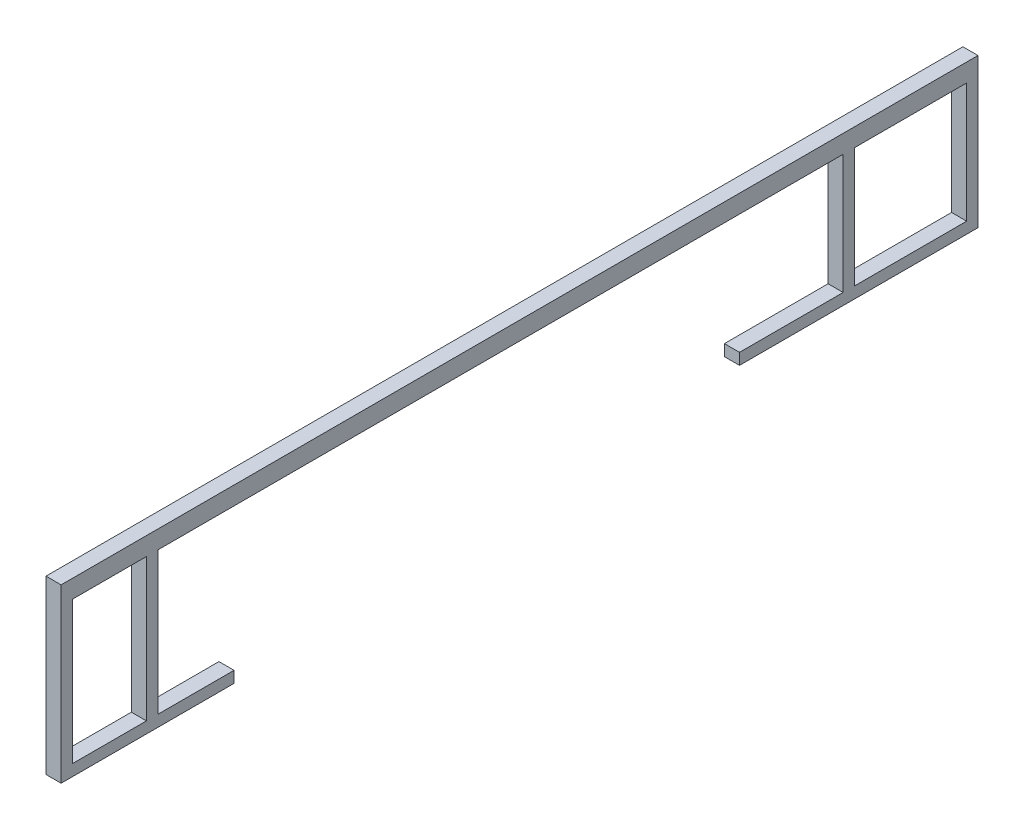
ISO-10303-21;
HEADER;
FILE_DESCRIPTION(('STEP AP214'),'2;1');
FILE_NAME('part.step','',(''),(''),'','','');
FILE_SCHEMA(('AUTOMOTIVE_DESIGN { 1 0 10303 214 1 1 1 1 }'));
ENDSEC;
DATA;
#1=APPLICATION_CONTEXT('core data for automotive mechanical design processes');
#2=APPLICATION_PROTOCOL_DEFINITION('international standard','automotive_design',2000,#1);
#3=PRODUCT_CONTEXT('',#1,'mechanical');
#4=PRODUCT('Part','Part','',(#3));
#5=PRODUCT_RELATED_PRODUCT_CATEGORY('part','',(#4));
#6=PRODUCT_DEFINITION_FORMATION('','',#4);
#7=PRODUCT_DEFINITION_CONTEXT('part definition',#1,'design');
#8=PRODUCT_DEFINITION('design','',#6,#7);
#9=PRODUCT_DEFINITION_SHAPE('','',#8);
#10=(LENGTH_UNIT() NAMED_UNIT(*) SI_UNIT(.MILLI.,.METRE.));
#11=(NAMED_UNIT(*) PLANE_ANGLE_UNIT() SI_UNIT($,.RADIAN.));
#12=(NAMED_UNIT(*) SI_UNIT($,.STERADIAN.) SOLID_ANGLE_UNIT());
#13=UNCERTAINTY_MEASURE_WITH_UNIT(LENGTH_MEASURE(1.E-05),#10,'distance_accuracy_value','');
#14=(GEOMETRIC_REPRESENTATION_CONTEXT(3) GLOBAL_UNCERTAINTY_ASSIGNED_CONTEXT((#13)) GLOBAL_UNIT_ASSIGNED_CONTEXT((#10,
#11,#12)) REPRESENTATION_CONTEXT('',''));
#15=CARTESIAN_POINT('',(0.,0.,0.));
#16=DIRECTION('',(0.,0.,1.));
#17=DIRECTION('',(1.,0.,0.));
#18=AXIS2_PLACEMENT_3D('',#15,#16,#17);
#19=CARTESIAN_POINT('',(1100.,-1000.,-1020.));
#20=CARTESIAN_POINT('',(1100.,-366.,-1020.));
#21=CARTESIAN_POINT('',(1180.,-1000.,-1020.));
#22=CARTESIAN_POINT('',(1180.,-366.,-1020.));
#23=B_SPLINE_SURFACE_WITH_KNOTS('',1,1,((#19,#20),(#21,#22)),.UNSPECIFIED.,.F.,.F.,.F.,(2,2),(2,
2),(0.,80.),(0.,634.),.UNSPECIFIED.);
#24=CARTESIAN_POINT('',(1180.,-270.,-1020.));
#25=CARTESIAN_POINT('',(1180.,-1180.,-1020.));
#26=B_SPLINE_CURVE_WITH_KNOTS('',1,(#24,#25),.UNSPECIFIED.,.F.,.F.,(2,2),(0.,910.),.UNSPECIFIED.);
#27=CARTESIAN_POINT('',(1180.,-366.,-1020.));
#28=VERTEX_POINT('',#27);
#29=CARTESIAN_POINT('',(1180.,-1000.,-1020.));
#30=VERTEX_POINT('',#29);
#31=EDGE_CURVE('E1258',#28,#30,#26,.T.);
#32=CARTESIAN_POINT('',(1100.,-366.,-1020.));
#33=CARTESIAN_POINT('',(1180.,-366.,-1020.));
#34=B_SPLINE_CURVE_WITH_KNOTS('',1,(#32,#33),.UNSPECIFIED.,.F.,.F.,(2,2),(0.,80.),.UNSPECIFIED.);
#35=CARTESIAN_POINT('',(1100.,-366.,-1020.));
#36=VERTEX_POINT('',#35);
#37=EDGE_CURVE('E221',#36,#28,#34,.T.);
#38=CARTESIAN_POINT('',(1100.,-1180.,-1020.));
#39=CARTESIAN_POINT('',(1100.,-270.,-1020.));
#40=B_SPLINE_CURVE_WITH_KNOTS('',1,(#38,#39),.UNSPECIFIED.,.F.,.F.,(2,2),(-814.,96.),.UNSPECIFIED.);
#41=CARTESIAN_POINT('',(1100.,-1000.,-1020.));
#42=VERTEX_POINT('',#41);
#43=EDGE_CURVE('E218',#42,#36,#40,.T.);
#44=CARTESIAN_POINT('',(1180.,-1000.,-1020.));
#45=CARTESIAN_POINT('',(1100.,-1000.,-1020.));
#46=B_SPLINE_CURVE_WITH_KNOTS('',1,(#44,#45),.UNSPECIFIED.,.F.,.F.,(2,2),(0.,80.),.UNSPECIFIED.);
#47=EDGE_CURVE('E200',#30,#42,#46,.T.);
#48=ORIENTED_EDGE('',*,*,#31,.F.);
#49=ORIENTED_EDGE('',*,*,#37,.F.);
#50=ORIENTED_EDGE('',*,*,#43,.F.);
#51=ORIENTED_EDGE('',*,*,#47,.F.);
#52=EDGE_LOOP('',(#48,#49,#50,#51));
#53=FACE_BOUND('',#52,.T.);
#54=ADVANCED_FACE('F18',(#53),#23,.T.);
#55=CARTESIAN_POINT('',(1180.,-1000.,-1674.));
#56=CARTESIAN_POINT('',(1180.,-1000.,-471.));
#57=CARTESIAN_POINT('',(1100.,-1000.,-1674.));
#58=CARTESIAN_POINT('',(1100.,-1000.,-471.));
#59=B_SPLINE_SURFACE_WITH_KNOTS('',1,1,((#55,#56),(#57,#58)),.UNSPECIFIED.,.F.,.F.,.F.,(2,2),(2,
2),(0.,80.),(0.,1203.),.UNSPECIFIED.);
#60=CARTESIAN_POINT('',(1180.,-1000.,-1734.));
#61=CARTESIAN_POINT('',(1180.,-1000.,3122.));
#62=B_SPLINE_CURVE_WITH_KNOTS('',1,(#60,#61),.UNSPECIFIED.,.F.,.F.,(2,2),(0.,4856.),.UNSPECIFIED.);
#63=CARTESIAN_POINT('',(1180.,-1000.,-471.));
#64=VERTEX_POINT('',#63);
#65=EDGE_CURVE('E209',#30,#64,#62,.T.);
#66=CARTESIAN_POINT('',(1100.,-1000.,3122.));
#67=CARTESIAN_POINT('',(1100.,-1000.,-1734.));
#68=B_SPLINE_CURVE_WITH_KNOTS('',1,(#66,#67),.UNSPECIFIED.,.F.,.F.,(2,2),(0.,4856.),.UNSPECIFIED.);
#69=CARTESIAN_POINT('',(1100.,-1000.,-471.));
#70=VERTEX_POINT('',#69);
#71=EDGE_CURVE('E205',#70,#42,#68,.T.);
#72=CARTESIAN_POINT('',(1180.,-1000.,-471.));
#73=CARTESIAN_POINT('',(1100.,-1000.,-471.));
#74=B_SPLINE_CURVE_WITH_KNOTS('',1,(#72,#73),.UNSPECIFIED.,.F.,.F.,(2,2),(1100.,1180.),.UNSPECIFIED.);
#75=EDGE_CURVE('E214',#64,#70,#74,.T.);
#76=ORIENTED_EDGE('',*,*,#65,.F.);
#77=ORIENTED_EDGE('',*,*,#47,.T.);
#78=ORIENTED_EDGE('',*,*,#71,.F.);
#79=ORIENTED_EDGE('',*,*,#75,.F.);
#80=EDGE_LOOP('',(#76,#77,#78,#79));
#81=FACE_BOUND('',#80,.T.);
#82=ADVANCED_FACE('F203',(#81),#59,.T.);
#83=CARTESIAN_POINT('',(1100.,-1000.,-471.));
#84=CARTESIAN_POINT('',(1180.,-1000.,-471.));
#85=CARTESIAN_POINT('',(1100.,-1060.,-471.));
#86=CARTESIAN_POINT('',(1180.,-1060.,-471.));
#87=B_SPLINE_SURFACE_WITH_KNOTS('',1,1,((#83,#84),(#85,#86)),.UNSPECIFIED.,.F.,.F.,.F.,(2,2),(2,
2),(-60.,0.),(1100.,1180.),.UNSPECIFIED.);
#88=CARTESIAN_POINT('',(1100.,-1180.,-471.));
#89=CARTESIAN_POINT('',(1100.,-270.,-471.));
#90=B_SPLINE_CURVE_WITH_KNOTS('',1,(#88,#89),.UNSPECIFIED.,.F.,.F.,(2,2),(-814.,96.),.UNSPECIFIED.);
#91=CARTESIAN_POINT('',(1100.,-1060.,-471.));
#92=VERTEX_POINT('',#91);
#93=EDGE_CURVE('E234',#92,#70,#90,.T.);
#94=CARTESIAN_POINT('',(1180.,-1060.,-471.));
#95=CARTESIAN_POINT('',(1100.,-1060.,-471.));
#96=B_SPLINE_CURVE_WITH_KNOTS('',1,(#94,#95),.UNSPECIFIED.,.F.,.F.,(2,2),(1100.,1180.),.UNSPECIFIED.);
#97=CARTESIAN_POINT('',(1180.,-1060.,-471.));
#98=VERTEX_POINT('',#97);
#99=EDGE_CURVE('E1078',#98,#92,#96,.T.);
#100=CARTESIAN_POINT('',(1180.,-270.,-471.));
#101=CARTESIAN_POINT('',(1180.,-1180.,-471.));
#102=B_SPLINE_CURVE_WITH_KNOTS('',1,(#100,#101),.UNSPECIFIED.,.F.,.F.,(2,2),(0.,910.),.UNSPECIFIED.);
#103=EDGE_CURVE('E1089',#64,#98,#102,.T.);
#104=ORIENTED_EDGE('',*,*,#75,.T.);
#105=ORIENTED_EDGE('',*,*,#93,.F.);
#106=ORIENTED_EDGE('',*,*,#99,.F.);
#107=ORIENTED_EDGE('',*,*,#103,.F.);
#108=EDGE_LOOP('',(#104,#105,#106,#107));
#109=FACE_BOUND('',#108,.T.);
#110=ADVANCED_FACE('F1041',(#109),#87,.T.);
#111=CARTESIAN_POINT('',(1100.,-1060.,-471.));
#112=CARTESIAN_POINT('',(1180.,-1060.,-471.));
#113=CARTESIAN_POINT('',(1100.,-1060.,-1734.));
#114=CARTESIAN_POINT('',(1180.,-1060.,-1734.));
#115=B_SPLINE_SURFACE_WITH_KNOTS('',1,1,((#111,#112),(#113,#114)),.UNSPECIFIED.,.F.,.F.,.F.,(2,
2),(2,2),(3593.,4856.),(1100.,1180.),.UNSPECIFIED.);
#116=CARTESIAN_POINT('',(1100.,-1060.,-1734.));
#117=CARTESIAN_POINT('',(1100.,-1060.,3122.));
#118=B_SPLINE_CURVE_WITH_KNOTS('',1,(#116,#117),.UNSPECIFIED.,.F.,.F.,(2,2),(0.,4856.),.UNSPECIFIED.);
#119=CARTESIAN_POINT('',(1100.,-1060.,-1734.));
#120=VERTEX_POINT('',#119);
#121=EDGE_CURVE('E1066',#120,#92,#118,.T.);
#122=CARTESIAN_POINT('',(1100.,-1060.,-1734.));
#123=CARTESIAN_POINT('',(1180.,-1060.,-1734.));
#124=B_SPLINE_CURVE_WITH_KNOTS('',1,(#122,#123),.UNSPECIFIED.,.F.,.F.,(2,2),(1100.,1180.),.UNSPECIFIED.);
#125=CARTESIAN_POINT('',(1180.,-1060.,-1734.));
#126=VERTEX_POINT('',#125);
#127=EDGE_CURVE('E992',#120,#126,#124,.T.);
#128=CARTESIAN_POINT('',(1180.,-1060.,3122.));
#129=CARTESIAN_POINT('',(1180.,-1060.,-1734.));
#130=B_SPLINE_CURVE_WITH_KNOTS('',1,(#128,#129),.UNSPECIFIED.,.F.,.F.,(2,2),(0.,4856.),.UNSPECIFIED.);
#131=EDGE_CURVE('E1461',#98,#126,#130,.T.);
#132=ORIENTED_EDGE('',*,*,#99,.T.);
#133=ORIENTED_EDGE('',*,*,#121,.F.);
#134=ORIENTED_EDGE('',*,*,#127,.T.);
#135=ORIENTED_EDGE('',*,*,#131,.F.);
#136=EDGE_LOOP('',(#132,#133,#134,#135));
#137=FACE_BOUND('',#136,.T.);
#138=ADVANCED_FACE('F1030',(#137),#115,.T.);
#139=CARTESIAN_POINT('',(1180.,-1060.,-1734.));
#140=CARTESIAN_POINT('',(1100.,-1060.,-1734.));
#141=CARTESIAN_POINT('',(1180.,-270.,-1734.));
#142=CARTESIAN_POINT('',(1100.,-270.,-1734.));
#143=B_SPLINE_SURFACE_WITH_KNOTS('',1,1,((#139,#140),(#141,#142)),.UNSPECIFIED.,.F.,.F.,.F.,(2,
2),(2,2),(-1060.,-270.),(-1180.,-1100.),.UNSPECIFIED.);
#144=CARTESIAN_POINT('',(1180.,-1180.,-1734.));
#145=CARTESIAN_POINT('',(1180.,-270.,-1734.));
#146=B_SPLINE_CURVE_WITH_KNOTS('',1,(#144,#145),.UNSPECIFIED.,.F.,.F.,(2,2),(0.,910.),.UNSPECIFIED.);
#147=CARTESIAN_POINT('',(1180.,-270.,-1734.));
#148=VERTEX_POINT('',#147);
#149=EDGE_CURVE('E1003',#126,#148,#146,.T.);
#150=CARTESIAN_POINT('',(1100.,-270.,-1734.));
#151=CARTESIAN_POINT('',(1100.,-1180.,-1734.));
#152=B_SPLINE_CURVE_WITH_KNOTS('',1,(#150,#151),.UNSPECIFIED.,.F.,.F.,(2,2),(-814.,96.),.UNSPECIFIED.);
#153=CARTESIAN_POINT('',(1100.,-270.,-1734.));
#154=VERTEX_POINT('',#153);
#155=EDGE_CURVE('E980',#154,#120,#152,.T.);
#156=CARTESIAN_POINT('',(1180.,-270.,-1734.));
#157=CARTESIAN_POINT('',(1100.,-270.,-1734.));
#158=B_SPLINE_CURVE_WITH_KNOTS('',1,(#156,#157),.UNSPECIFIED.,.F.,.F.,(2,2),(0.,80.),.UNSPECIFIED.);
#159=EDGE_CURVE('E1014',#148,#154,#158,.T.);
#160=ORIENTED_EDGE('',*,*,#149,.F.);
#161=ORIENTED_EDGE('',*,*,#127,.F.);
#162=ORIENTED_EDGE('',*,*,#155,.F.);
#163=ORIENTED_EDGE('',*,*,#159,.F.);
#164=EDGE_LOOP('',(#160,#161,#162,#163));
#165=FACE_BOUND('',#164,.T.);
#166=ADVANCED_FACE('F942',(#165),#143,.F.);
#167=CARTESIAN_POINT('',(1100.,-270.,3122.));
#168=CARTESIAN_POINT('',(1100.,-270.,-1734.));
#169=CARTESIAN_POINT('',(1180.,-270.,3122.));
#170=CARTESIAN_POINT('',(1180.,-270.,-1734.));
#171=B_SPLINE_SURFACE_WITH_KNOTS('',1,1,((#167,#168),(#169,#170)),.UNSPECIFIED.,.F.,.F.,.F.,(2,
2),(2,2),(0.,80.),(0.,4856.),.UNSPECIFIED.);
#172=CARTESIAN_POINT('',(1100.,-270.,3122.));
#173=CARTESIAN_POINT('',(1100.,-270.,-1734.));
#174=B_SPLINE_CURVE_WITH_KNOTS('',1,(#172,#173),.UNSPECIFIED.,.F.,.F.,(2,2),(0.,4856.),.UNSPECIFIED.);
#175=CARTESIAN_POINT('',(1100.,-270.,3122.));
#176=VERTEX_POINT('',#175);
#177=EDGE_CURVE('E1500',#176,#154,#174,.T.);
#178=CARTESIAN_POINT('',(1100.,-270.,3122.));
#179=CARTESIAN_POINT('',(1180.,-270.,3122.));
#180=B_SPLINE_CURVE_WITH_KNOTS('',1,(#178,#179),.UNSPECIFIED.,.F.,.F.,(2,2),(0.,80.),.UNSPECIFIED.);
#181=CARTESIAN_POINT('',(1180.,-270.,3122.));
#182=VERTEX_POINT('',#181);
#183=EDGE_CURVE('E912',#176,#182,#180,.T.);
#184=CARTESIAN_POINT('',(1180.,-270.,-1734.));
#185=CARTESIAN_POINT('',(1180.,-270.,3122.));
#186=B_SPLINE_CURVE_WITH_KNOTS('',1,(#184,#185),.UNSPECIFIED.,.F.,.F.,(2,2),(0.,4856.),.UNSPECIFIED.);
#187=EDGE_CURVE('E925',#148,#182,#186,.T.);
#188=ORIENTED_EDGE('',*,*,#177,.F.);
#189=ORIENTED_EDGE('',*,*,#183,.T.);
#190=ORIENTED_EDGE('',*,*,#187,.F.);
#191=ORIENTED_EDGE('',*,*,#159,.T.);
#192=EDGE_LOOP('',(#188,#189,#190,#191));
#193=FACE_BOUND('',#192,.T.);
#194=ADVANCED_FACE('F931',(#193),#171,.T.);
#195=CARTESIAN_POINT('',(1100.,-1180.,3122.));
#196=CARTESIAN_POINT('',(1180.,-1180.,3122.));
#197=CARTESIAN_POINT('',(1100.,-270.,3122.));
#198=CARTESIAN_POINT('',(1180.,-270.,3122.));
#199=B_SPLINE_SURFACE_WITH_KNOTS('',1,1,((#195,#196),(#197,#198)),.UNSPECIFIED.,.F.,.F.,.F.,(2,
2),(2,2),(-1180.,-270.),(1100.,1180.),.UNSPECIFIED.);
#200=CARTESIAN_POINT('',(1100.,-1180.,3122.));
#201=CARTESIAN_POINT('',(1100.,-270.,3122.));
#202=B_SPLINE_CURVE_WITH_KNOTS('',1,(#200,#201),.UNSPECIFIED.,.F.,.F.,(2,2),(-814.,96.),.UNSPECIFIED.);
#203=CARTESIAN_POINT('',(1100.,-1180.,3122.));
#204=VERTEX_POINT('',#203);
#205=EDGE_CURVE('E901',#204,#176,#202,.T.);
#206=CARTESIAN_POINT('',(1180.,-1180.,3122.));
#207=CARTESIAN_POINT('',(1100.,-1180.,3122.));
#208=B_SPLINE_CURVE_WITH_KNOTS('',1,(#206,#207),.UNSPECIFIED.,.F.,.F.,(2,2),(1100.,1180.),.UNSPECIFIED.);
#209=CARTESIAN_POINT('',(1180.,-1180.,3122.));
#210=VERTEX_POINT('',#209);
#211=EDGE_CURVE('E824',#210,#204,#208,.T.);
#212=CARTESIAN_POINT('',(1180.,-270.,3122.));
#213=CARTESIAN_POINT('',(1180.,-1180.,3122.));
#214=B_SPLINE_CURVE_WITH_KNOTS('',1,(#212,#213),.UNSPECIFIED.,.F.,.F.,(2,2),(0.,910.),.UNSPECIFIED.);
#215=EDGE_CURVE('E880',#182,#210,#214,.T.);
#216=ORIENTED_EDGE('',*,*,#205,.F.);
#217=ORIENTED_EDGE('',*,*,#211,.F.);
#218=ORIENTED_EDGE('',*,*,#215,.F.);
#219=ORIENTED_EDGE('',*,*,#183,.F.);
#220=EDGE_LOOP('',(#216,#217,#218,#219));
#221=FACE_BOUND('',#220,.T.);
#222=ADVANCED_FACE('F841',(#221),#199,.F.);
#223=CARTESIAN_POINT('',(1100.,-1180.,3122.));
#224=CARTESIAN_POINT('',(1180.,-1180.,3122.));
#225=CARTESIAN_POINT('',(1100.,-1180.,2206.));
#226=CARTESIAN_POINT('',(1180.,-1180.,2206.));
#227=B_SPLINE_SURFACE_WITH_KNOTS('',1,1,((#223,#224),(#225,#226)),.UNSPECIFIED.,.F.,.F.,.F.,(2,
2),(2,2),(0.,916.),(1100.,1180.),.UNSPECIFIED.);
#228=CARTESIAN_POINT('',(1180.,-1180.,2206.));
#229=CARTESIAN_POINT('',(1100.,-1180.,2206.));
#230=B_SPLINE_CURVE_WITH_KNOTS('',1,(#228,#229),.UNSPECIFIED.,.F.,.F.,(2,2),(1100.,1180.),.UNSPECIFIED.);
#231=CARTESIAN_POINT('',(1180.,-1180.,2206.));
#232=VERTEX_POINT('',#231);
#233=CARTESIAN_POINT('',(1100.,-1180.,2206.));
#234=VERTEX_POINT('',#233);
#235=EDGE_CURVE('E790',#232,#234,#230,.T.);
#236=CARTESIAN_POINT('',(1180.,-1180.,3122.));
#237=CARTESIAN_POINT('',(1180.,-1180.,-1734.));
#238=B_SPLINE_CURVE_WITH_KNOTS('',1,(#236,#237),.UNSPECIFIED.,.F.,.F.,(2,2),(0.,4856.),.UNSPECIFIED.);
#239=EDGE_CURVE('E867',#210,#232,#238,.T.);
#240=CARTESIAN_POINT('',(1100.,-1180.,-1734.));
#241=CARTESIAN_POINT('',(1100.,-1180.,3122.));
#242=B_SPLINE_CURVE_WITH_KNOTS('',1,(#240,#241),.UNSPECIFIED.,.F.,.F.,(2,2),(0.,4856.),.UNSPECIFIED.);
#243=EDGE_CURVE('E1422',#234,#204,#242,.T.);
#244=ORIENTED_EDGE('',*,*,#235,.F.);
#245=ORIENTED_EDGE('',*,*,#239,.F.);
#246=ORIENTED_EDGE('',*,*,#211,.T.);
#247=ORIENTED_EDGE('',*,*,#243,.F.);
#248=EDGE_LOOP('',(#244,#245,#246,#247));
#249=FACE_BOUND('',#248,.T.);
#250=ADVANCED_FACE('F830',(#249),#227,.T.);
#251=CARTESIAN_POINT('',(1100.,-1180.,2206.));
#252=CARTESIAN_POINT('',(1180.,-1180.,2206.));
#253=CARTESIAN_POINT('',(1100.,-1120.,2206.));
#254=CARTESIAN_POINT('',(1180.,-1120.,2206.));
#255=B_SPLINE_SURFACE_WITH_KNOTS('',1,1,((#251,#252),(#253,#254)),.UNSPECIFIED.,.F.,.F.,.F.,(2,
2),(2,2),(0.,60.),(1100.,1180.),.UNSPECIFIED.);
#256=CARTESIAN_POINT('',(1100.,-270.,2206.));
#257=CARTESIAN_POINT('',(1100.,-1180.,2206.));
#258=B_SPLINE_CURVE_WITH_KNOTS('',1,(#256,#257),.UNSPECIFIED.,.F.,.F.,(2,2),(-814.,96.),.UNSPECIFIED.);
#259=CARTESIAN_POINT('',(1100.,-1120.,2206.));
#260=VERTEX_POINT('',#259);
#261=EDGE_CURVE('E802',#260,#234,#258,.T.);
#262=CARTESIAN_POINT('',(1180.,-1120.,2206.));
#263=CARTESIAN_POINT('',(1100.,-1120.,2206.));
#264=B_SPLINE_CURVE_WITH_KNOTS('',1,(#262,#263),.UNSPECIFIED.,.F.,.F.,(2,2),(0.,80.),.UNSPECIFIED.);
#265=CARTESIAN_POINT('',(1180.,-1120.,2206.));
#266=VERTEX_POINT('',#265);
#267=EDGE_CURVE('E812',#266,#260,#264,.T.);
#268=CARTESIAN_POINT('',(1180.,-1180.,2206.));
#269=CARTESIAN_POINT('',(1180.,-270.,2206.));
#270=B_SPLINE_CURVE_WITH_KNOTS('',1,(#268,#269),.UNSPECIFIED.,.F.,.F.,(2,2),(0.,910.),.UNSPECIFIED.);
#271=EDGE_CURVE('E779',#232,#266,#270,.T.);
#272=ORIENTED_EDGE('',*,*,#261,.F.);
#273=ORIENTED_EDGE('',*,*,#267,.F.);
#274=ORIENTED_EDGE('',*,*,#271,.F.);
#275=ORIENTED_EDGE('',*,*,#235,.T.);
#276=EDGE_LOOP('',(#272,#273,#274,#275));
#277=FACE_BOUND('',#276,.T.);
#278=ADVANCED_FACE('F742',(#277),#255,.T.);
#279=CARTESIAN_POINT('',(1100.,-1120.,3062.));
#280=CARTESIAN_POINT('',(1100.,-1120.,2206.));
#281=CARTESIAN_POINT('',(1180.,-1120.,3062.));
#282=CARTESIAN_POINT('',(1180.,-1120.,2206.));
#283=B_SPLINE_SURFACE_WITH_KNOTS('',1,1,((#279,#280),(#281,#282)),.UNSPECIFIED.,.F.,.F.,.F.,(2,
2),(2,2),(0.,80.),(0.,856.),.UNSPECIFIED.);
#284=CARTESIAN_POINT('',(1100.,-1120.,3122.));
#285=CARTESIAN_POINT('',(1100.,-1120.,-1734.));
#286=B_SPLINE_CURVE_WITH_KNOTS('',1,(#284,#285),.UNSPECIFIED.,.F.,.F.,(2,2),(0.,4856.),.UNSPECIFIED.);
#287=CARTESIAN_POINT('',(1100.,-1120.,2610.));
#288=VERTEX_POINT('',#287);
#289=EDGE_CURVE('E1423',#288,#260,#286,.T.);
#290=CARTESIAN_POINT('',(1180.,-1120.,2610.));
#291=CARTESIAN_POINT('',(1100.,-1120.,2610.));
#292=B_SPLINE_CURVE_WITH_KNOTS('',1,(#290,#291),.UNSPECIFIED.,.F.,.F.,(2,2),(0.,80.),.UNSPECIFIED.);
#293=CARTESIAN_POINT('',(1180.,-1120.,2610.));
#294=VERTEX_POINT('',#293);
#295=EDGE_CURVE('E692',#294,#288,#292,.T.);
#296=CARTESIAN_POINT('',(1180.,-1120.,-1734.));
#297=CARTESIAN_POINT('',(1180.,-1120.,3122.));
#298=B_SPLINE_CURVE_WITH_KNOTS('',1,(#296,#297),.UNSPECIFIED.,.F.,.F.,(2,2),(0.,4856.),.UNSPECIFIED.);
#299=EDGE_CURVE('E725',#266,#294,#298,.T.);
#300=ORIENTED_EDGE('',*,*,#289,.F.);
#301=ORIENTED_EDGE('',*,*,#295,.F.);
#302=ORIENTED_EDGE('',*,*,#299,.F.);
#303=ORIENTED_EDGE('',*,*,#267,.T.);
#304=EDGE_LOOP('',(#300,#301,#302,#303));
#305=FACE_BOUND('',#304,.T.);
#306=ADVANCED_FACE('F731',(#305),#283,.T.);
#307=CARTESIAN_POINT('',(1100.,-366.,2610.));
#308=CARTESIAN_POINT('',(1100.,-1120.,2610.));
#309=CARTESIAN_POINT('',(1180.,-366.,2610.));
#310=CARTESIAN_POINT('',(1180.,-1120.,2610.));
#311=B_SPLINE_SURFACE_WITH_KNOTS('',1,1,((#307,#308),(#309,#310)),.UNSPECIFIED.,.F.,.F.,.F.,(2,
2),(2,2),(0.,80.),(0.,754.),.UNSPECIFIED.);
#312=CARTESIAN_POINT('',(1100.,-270.,2610.));
#313=CARTESIAN_POINT('',(1100.,-1180.,2610.));
#314=B_SPLINE_CURVE_WITH_KNOTS('',1,(#312,#313),.UNSPECIFIED.,.F.,.F.,(2,2),(-814.,96.),.UNSPECIFIED.);
#315=CARTESIAN_POINT('',(1100.,-366.,2610.));
#316=VERTEX_POINT('',#315);
#317=EDGE_CURVE('E703',#316,#288,#314,.T.);
#318=CARTESIAN_POINT('',(1180.,-366.,2610.));
#319=CARTESIAN_POINT('',(1100.,-366.,2610.));
#320=B_SPLINE_CURVE_WITH_KNOTS('',1,(#318,#319),.UNSPECIFIED.,.F.,.F.,(2,2),(0.,80.),.UNSPECIFIED.);
#321=CARTESIAN_POINT('',(1180.,-366.,2610.));
#322=VERTEX_POINT('',#321);
#323=EDGE_CURVE('E667',#322,#316,#320,.T.);
#324=CARTESIAN_POINT('',(1180.,-1180.,2610.));
#325=CARTESIAN_POINT('',(1180.,-270.,2610.));
#326=B_SPLINE_CURVE_WITH_KNOTS('',1,(#324,#325),.UNSPECIFIED.,.F.,.F.,(2,2),(0.,910.),.UNSPECIFIED.);
#327=EDGE_CURVE('E681',#294,#322,#326,.T.);
#328=ORIENTED_EDGE('',*,*,#317,.F.);
#329=ORIENTED_EDGE('',*,*,#323,.F.);
#330=ORIENTED_EDGE('',*,*,#327,.F.);
#331=ORIENTED_EDGE('',*,*,#295,.T.);
#332=EDGE_LOOP('',(#328,#329,#330,#331));
#333=FACE_BOUND('',#332,.T.);
#334=ADVANCED_FACE('F640',(#333),#311,.T.);
#335=CARTESIAN_POINT('',(1180.,-366.,3062.));
#336=CARTESIAN_POINT('',(1180.,-366.,-1674.));
#337=CARTESIAN_POINT('',(1100.,-366.,3062.));
#338=CARTESIAN_POINT('',(1100.,-366.,-1674.));
#339=B_SPLINE_SURFACE_WITH_KNOTS('',1,1,((#335,#336),(#337,#338)),.UNSPECIFIED.,.F.,.F.,.F.,(2,
2),(2,2),(0.,80.),(60.,4796.),.UNSPECIFIED.);
#340=CARTESIAN_POINT('',(1180.,-366.,3122.));
#341=CARTESIAN_POINT('',(1180.,-366.,-1734.));
#342=B_SPLINE_CURVE_WITH_KNOTS('',1,(#340,#341),.UNSPECIFIED.,.F.,.F.,(2,2),(0.,4856.),.UNSPECIFIED.);
#343=EDGE_CURVE('E1520',#322,#28,#342,.T.);
#344=CARTESIAN_POINT('',(1100.,-366.,-1734.));
#345=CARTESIAN_POINT('',(1100.,-366.,3122.));
#346=B_SPLINE_CURVE_WITH_KNOTS('',1,(#344,#345),.UNSPECIFIED.,.F.,.F.,(2,2),(0.,4856.),.UNSPECIFIED.);
#347=EDGE_CURVE('E227',#36,#316,#346,.T.);
#348=ORIENTED_EDGE('',*,*,#343,.F.);
#349=ORIENTED_EDGE('',*,*,#323,.T.);
#350=ORIENTED_EDGE('',*,*,#347,.F.);
#351=ORIENTED_EDGE('',*,*,#37,.T.);
#352=EDGE_LOOP('',(#348,#349,#350,#351));
#353=FACE_BOUND('',#352,.T.);
#354=ADVANCED_FACE('F629',(#353),#339,.T.);
#355=CARTESIAN_POINT('',(1180.,-366.,-1674.));
#356=CARTESIAN_POINT('',(1180.,-1000.,-1674.));
#357=CARTESIAN_POINT('',(1100.,-366.,-1674.));
#358=CARTESIAN_POINT('',(1100.,-1000.,-1674.));
#359=B_SPLINE_SURFACE_WITH_KNOTS('',1,1,((#355,#356),(#357,#358)),.UNSPECIFIED.,.F.,.F.,.F.,(2,
2),(2,2),(0.,80.),(92.,726.),.UNSPECIFIED.);
#360=CARTESIAN_POINT('',(1100.,-1180.,-1674.));
#361=CARTESIAN_POINT('',(1100.,-270.,-1674.));
#362=B_SPLINE_CURVE_WITH_KNOTS('',1,(#360,#361),.UNSPECIFIED.,.F.,.F.,(2,2),(-814.,96.),.UNSPECIFIED.);
#363=CARTESIAN_POINT('',(1100.,-1000.,-1674.));
#364=VERTEX_POINT('',#363);
#365=CARTESIAN_POINT('',(1100.,-366.,-1674.));
#366=VERTEX_POINT('',#365);
#367=EDGE_CURVE('E604',#364,#366,#362,.T.);
#368=CARTESIAN_POINT('',(1180.,-1000.,-1674.));
#369=CARTESIAN_POINT('',(1100.,-1000.,-1674.));
#370=B_SPLINE_CURVE_WITH_KNOTS('',1,(#368,#369),.UNSPECIFIED.,.F.,.F.,(2,2),(0.,80.),.UNSPECIFIED.);
#371=CARTESIAN_POINT('',(1180.,-1000.,-1674.));
#372=VERTEX_POINT('',#371);
#373=EDGE_CURVE('E614',#372,#364,#370,.T.);
#374=CARTESIAN_POINT('',(1180.,-270.,-1674.));
#375=CARTESIAN_POINT('',(1180.,-1180.,-1674.));
#376=B_SPLINE_CURVE_WITH_KNOTS('',1,(#374,#375),.UNSPECIFIED.,.F.,.F.,(2,2),(0.,910.),.UNSPECIFIED.);
#377=CARTESIAN_POINT('',(1180.,-366.,-1674.));
#378=VERTEX_POINT('',#377);
#379=EDGE_CURVE('E585',#378,#372,#376,.T.);
#380=CARTESIAN_POINT('',(1100.,-366.,-1674.));
#381=CARTESIAN_POINT('',(1180.,-366.,-1674.));
#382=B_SPLINE_CURVE_WITH_KNOTS('',1,(#380,#381),.UNSPECIFIED.,.F.,.F.,(2,2),(0.,80.),.UNSPECIFIED.);
#383=EDGE_CURVE('E427',#366,#378,#382,.T.);
#384=ORIENTED_EDGE('',*,*,#367,.F.);
#385=ORIENTED_EDGE('',*,*,#373,.F.);
#386=ORIENTED_EDGE('',*,*,#379,.F.);
#387=ORIENTED_EDGE('',*,*,#383,.F.);
#388=EDGE_LOOP('',(#384,#385,#386,#387));
#389=FACE_BOUND('',#388,.T.);
#390=ADVANCED_FACE('F549',(#389),#359,.T.);
#391=CARTESIAN_POINT('',(1180.,-1000.,-1674.));
#392=CARTESIAN_POINT('',(1180.,-1000.,-471.));
#393=CARTESIAN_POINT('',(1100.,-1000.,-1674.));
#394=CARTESIAN_POINT('',(1100.,-1000.,-471.));
#395=B_SPLINE_SURFACE_WITH_KNOTS('',1,1,((#391,#392),(#393,#394)),.UNSPECIFIED.,.F.,.F.,.F.,(2,
2),(2,2),(0.,80.),(0.,1203.),.UNSPECIFIED.);
#396=CARTESIAN_POINT('',(1100.,-1000.,3122.));
#397=CARTESIAN_POINT('',(1100.,-1000.,-1734.));
#398=B_SPLINE_CURVE_WITH_KNOTS('',1,(#396,#397),.UNSPECIFIED.,.F.,.F.,(2,2),(0.,4856.),.UNSPECIFIED.);
#399=CARTESIAN_POINT('',(1100.,-1000.,-1080.));
#400=VERTEX_POINT('',#399);
#401=EDGE_CURVE('E1474',#400,#364,#398,.T.);
#402=CARTESIAN_POINT('',(1180.,-1000.,-1080.));
#403=CARTESIAN_POINT('',(1100.,-1000.,-1080.));
#404=B_SPLINE_CURVE_WITH_KNOTS('',1,(#402,#403),.UNSPECIFIED.,.F.,.F.,(2,2),(0.,80.),.UNSPECIFIED.);
#405=CARTESIAN_POINT('',(1180.,-1000.,-1080.));
#406=VERTEX_POINT('',#405);
#407=EDGE_CURVE('E497',#406,#400,#404,.T.);
#408=CARTESIAN_POINT('',(1180.,-1000.,-1734.));
#409=CARTESIAN_POINT('',(1180.,-1000.,3122.));
#410=B_SPLINE_CURVE_WITH_KNOTS('',1,(#408,#409),.UNSPECIFIED.,.F.,.F.,(2,2),(0.,4856.),.UNSPECIFIED.);
#411=EDGE_CURVE('E532',#372,#406,#410,.T.);
#412=ORIENTED_EDGE('',*,*,#401,.F.);
#413=ORIENTED_EDGE('',*,*,#407,.F.);
#414=ORIENTED_EDGE('',*,*,#411,.F.);
#415=ORIENTED_EDGE('',*,*,#373,.T.);
#416=EDGE_LOOP('',(#412,#413,#414,#415));
#417=FACE_BOUND('',#416,.T.);
#418=ADVANCED_FACE('F538',(#417),#395,.T.);
#419=CARTESIAN_POINT('',(1180.,-1000.,-1080.));
#420=CARTESIAN_POINT('',(1180.,-366.,-1080.));
#421=CARTESIAN_POINT('',(1100.,-1000.,-1080.));
#422=CARTESIAN_POINT('',(1100.,-366.,-1080.));
#423=B_SPLINE_SURFACE_WITH_KNOTS('',1,1,((#419,#420),(#421,#422)),.UNSPECIFIED.,.F.,.F.,.F.,(2,
2),(2,2),(0.,80.),(0.,634.),.UNSPECIFIED.);
#424=CARTESIAN_POINT('',(1100.,-270.,-1080.));
#425=CARTESIAN_POINT('',(1100.,-1180.,-1080.));
#426=B_SPLINE_CURVE_WITH_KNOTS('',1,(#424,#425),.UNSPECIFIED.,.F.,.F.,(2,2),(-814.,96.),.UNSPECIFIED.);
#427=CARTESIAN_POINT('',(1100.,-366.,-1080.));
#428=VERTEX_POINT('',#427);
#429=EDGE_CURVE('E509',#428,#400,#426,.T.);
#430=CARTESIAN_POINT('',(1180.,-366.,-1080.));
#431=CARTESIAN_POINT('',(1100.,-366.,-1080.));
#432=B_SPLINE_CURVE_WITH_KNOTS('',1,(#430,#431),.UNSPECIFIED.,.F.,.F.,(2,2),(0.,80.),.UNSPECIFIED.);
#433=CARTESIAN_POINT('',(1180.,-366.,-1080.));
#434=VERTEX_POINT('',#433);
#435=EDGE_CURVE('E519',#434,#428,#432,.T.);
#436=CARTESIAN_POINT('',(1180.,-1180.,-1080.));
#437=CARTESIAN_POINT('',(1180.,-270.,-1080.));
#438=B_SPLINE_CURVE_WITH_KNOTS('',1,(#436,#437),.UNSPECIFIED.,.F.,.F.,(2,2),(0.,910.),.UNSPECIFIED.);
#439=EDGE_CURVE('E485',#406,#434,#438,.T.);
#440=ORIENTED_EDGE('',*,*,#429,.F.);
#441=ORIENTED_EDGE('',*,*,#435,.F.);
#442=ORIENTED_EDGE('',*,*,#439,.F.);
#443=ORIENTED_EDGE('',*,*,#407,.T.);
#444=EDGE_LOOP('',(#440,#441,#442,#443));
#445=FACE_BOUND('',#444,.T.);
#446=ADVANCED_FACE('F444',(#445),#423,.T.);
#447=CARTESIAN_POINT('',(1180.,-366.,3062.));
#448=CARTESIAN_POINT('',(1180.,-366.,-1674.));
#449=CARTESIAN_POINT('',(1100.,-366.,3062.));
#450=CARTESIAN_POINT('',(1100.,-366.,-1674.));
#451=B_SPLINE_SURFACE_WITH_KNOTS('',1,1,((#447,#448),(#449,#450)),.UNSPECIFIED.,.F.,.F.,.F.,(2,
2),(2,2),(0.,80.),(60.,4796.),.UNSPECIFIED.);
#452=CARTESIAN_POINT('',(1100.,-366.,-1734.));
#453=CARTESIAN_POINT('',(1100.,-366.,3122.));
#454=B_SPLINE_CURVE_WITH_KNOTS('',1,(#452,#453),.UNSPECIFIED.,.F.,.F.,(2,2),(0.,4856.),.UNSPECIFIED.);
#455=EDGE_CURVE('E471',#366,#428,#454,.T.);
#456=CARTESIAN_POINT('',(1180.,-366.,3122.));
#457=CARTESIAN_POINT('',(1180.,-366.,-1734.));
#458=B_SPLINE_CURVE_WITH_KNOTS('',1,(#456,#457),.UNSPECIFIED.,.F.,.F.,(2,2),(0.,4856.),.UNSPECIFIED.);
#459=EDGE_CURVE('E1373',#434,#378,#458,.T.);
#460=ORIENTED_EDGE('',*,*,#435,.T.);
#461=ORIENTED_EDGE('',*,*,#455,.F.);
#462=ORIENTED_EDGE('',*,*,#383,.T.);
#463=ORIENTED_EDGE('',*,*,#459,.F.);
#464=EDGE_LOOP('',(#460,#461,#462,#463));
#465=FACE_BOUND('',#464,.T.);
#466=ADVANCED_FACE('F433',(#465),#451,.T.);
#467=CARTESIAN_POINT('',(1180.,-366.,2670.));
#468=CARTESIAN_POINT('',(1180.,-1120.,2670.));
#469=CARTESIAN_POINT('',(1100.,-366.,2670.));
#470=CARTESIAN_POINT('',(1100.,-1120.,2670.));
#471=B_SPLINE_SURFACE_WITH_KNOTS('',1,1,((#467,#468),(#469,#470)),.UNSPECIFIED.,.F.,.F.,.F.,(2,
2),(2,2),(0.,80.),(0.,754.),.UNSPECIFIED.);
#472=CARTESIAN_POINT('',(1180.,-270.,2670.));
#473=CARTESIAN_POINT('',(1180.,-1180.,2670.));
#474=B_SPLINE_CURVE_WITH_KNOTS('',1,(#472,#473),.UNSPECIFIED.,.F.,.F.,(2,2),(0.,910.),.UNSPECIFIED.);
#475=CARTESIAN_POINT('',(1180.,-366.,2670.));
#476=VERTEX_POINT('',#475);
#477=CARTESIAN_POINT('',(1180.,-1120.,2670.));
#478=VERTEX_POINT('',#477);
#479=EDGE_CURVE('E402',#476,#478,#474,.T.);
#480=CARTESIAN_POINT('',(1100.,-366.,2670.));
#481=CARTESIAN_POINT('',(1180.,-366.,2670.));
#482=B_SPLINE_CURVE_WITH_KNOTS('',1,(#480,#481),.UNSPECIFIED.,.F.,.F.,(2,2),(0.,80.),.UNSPECIFIED.);
#483=CARTESIAN_POINT('',(1100.,-366.,2670.));
#484=VERTEX_POINT('',#483);
#485=EDGE_CURVE('E413',#484,#476,#482,.T.);
#486=CARTESIAN_POINT('',(1100.,-1180.,2670.));
#487=CARTESIAN_POINT('',(1100.,-270.,2670.));
#488=B_SPLINE_CURVE_WITH_KNOTS('',1,(#486,#487),.UNSPECIFIED.,.F.,.F.,(2,2),(-814.,96.),.UNSPECIFIED.);
#489=CARTESIAN_POINT('',(1100.,-1120.,2670.));
#490=VERTEX_POINT('',#489);
#491=EDGE_CURVE('E379',#490,#484,#488,.T.);
#492=CARTESIAN_POINT('',(1180.,-1120.,2670.));
#493=CARTESIAN_POINT('',(1100.,-1120.,2670.));
#494=B_SPLINE_CURVE_WITH_KNOTS('',1,(#492,#493),.UNSPECIFIED.,.F.,.F.,(2,2),(0.,80.),.UNSPECIFIED.);
#495=EDGE_CURVE('E392',#478,#490,#494,.T.);
#496=ORIENTED_EDGE('',*,*,#479,.F.);
#497=ORIENTED_EDGE('',*,*,#485,.F.);
#498=ORIENTED_EDGE('',*,*,#491,.F.);
#499=ORIENTED_EDGE('',*,*,#495,.F.);
#500=EDGE_LOOP('',(#496,#497,#498,#499));
#501=FACE_BOUND('',#500,.T.);
#502=ADVANCED_FACE('F257',(#501),#471,.T.);
#503=CARTESIAN_POINT('',(1100.,-1180.,3122.));
#504=CARTESIAN_POINT('',(1100.,-1180.,-1734.));
#505=CARTESIAN_POINT('',(1100.,-270.,3122.));
#506=CARTESIAN_POINT('',(1100.,-270.,-1734.));
#507=B_SPLINE_SURFACE_WITH_KNOTS('',1,1,((#503,#504),(#505,#506)),.UNSPECIFIED.,.F.,.F.,.F.,(2,
2),(2,2),(-814.,96.),(0.,4856.),.UNSPECIFIED.);
#508=CARTESIAN_POINT('',(1100.,-366.,3062.));
#509=CARTESIAN_POINT('',(1100.,-366.,-1674.));
#510=B_SPLINE_CURVE_WITH_KNOTS('',1,(#508,#509),.UNSPECIFIED.,.F.,.F.,(2,2),(60.,4796.),.UNSPECIFIED.);
#511=CARTESIAN_POINT('',(1100.,-366.,3062.));
#512=VERTEX_POINT('',#511);
#513=EDGE_CURVE('E365',#512,#484,#510,.T.);
#514=CARTESIAN_POINT('',(1100.,-1120.,3062.));
#515=CARTESIAN_POINT('',(1100.,-366.,3062.));
#516=B_SPLINE_CURVE_WITH_KNOTS('',1,(#514,#515),.UNSPECIFIED.,.F.,.F.,(2,2),(92.,846.),.UNSPECIFIED.);
#517=CARTESIAN_POINT('',(1100.,-1120.,3062.));
#518=VERTEX_POINT('',#517);
#519=EDGE_CURVE('E1505',#518,#512,#516,.T.);
#520=CARTESIAN_POINT('',(1100.,-1120.,2206.));
#521=CARTESIAN_POINT('',(1100.,-1120.,3062.));
#522=B_SPLINE_CURVE_WITH_KNOTS('',1,(#520,#521),.UNSPECIFIED.,.F.,.F.,(2,2),(0.,856.),.UNSPECIFIED.);
#523=EDGE_CURVE('E1219',#490,#518,#522,.T.);
#524=ORIENTED_EDGE('',*,*,#491,.T.);
#525=ORIENTED_EDGE('',*,*,#513,.F.);
#526=ORIENTED_EDGE('',*,*,#519,.F.);
#527=ORIENTED_EDGE('',*,*,#523,.F.);
#528=EDGE_LOOP('',(#524,#525,#526,#527));
#529=FACE_BOUND('',#528,.T.);
#530=ORIENTED_EDGE('',*,*,#429,.T.);
#531=ORIENTED_EDGE('',*,*,#401,.T.);
#532=ORIENTED_EDGE('',*,*,#367,.T.);
#533=ORIENTED_EDGE('',*,*,#455,.T.);
#534=EDGE_LOOP('',(#530,#531,#532,#533));
#535=FACE_BOUND('',#534,.T.);
#536=ORIENTED_EDGE('',*,*,#317,.T.);
#537=ORIENTED_EDGE('',*,*,#289,.T.);
#538=ORIENTED_EDGE('',*,*,#261,.T.);
#539=ORIENTED_EDGE('',*,*,#243,.T.);
#540=ORIENTED_EDGE('',*,*,#205,.T.);
#541=ORIENTED_EDGE('',*,*,#177,.T.);
#542=ORIENTED_EDGE('',*,*,#155,.T.);
#543=ORIENTED_EDGE('',*,*,#121,.T.);
#544=ORIENTED_EDGE('',*,*,#93,.T.);
#545=ORIENTED_EDGE('',*,*,#71,.T.);
#546=ORIENTED_EDGE('',*,*,#43,.T.);
#547=ORIENTED_EDGE('',*,*,#347,.T.);
#548=EDGE_LOOP('',(#536,#537,#538,#539,#540,#541,#542,#543,#544,#545,#546,#547));
#549=FACE_BOUND('',#548,.T.);
#550=ADVANCED_FACE('F231',(#529,#535,#549),#507,.T.);
#551=CARTESIAN_POINT('',(1180.,-366.,3062.));
#552=CARTESIAN_POINT('',(1180.,-366.,-1674.));
#553=CARTESIAN_POINT('',(1100.,-366.,3062.));
#554=CARTESIAN_POINT('',(1100.,-366.,-1674.));
#555=B_SPLINE_SURFACE_WITH_KNOTS('',1,1,((#551,#552),(#553,#554)),.UNSPECIFIED.,.F.,.F.,.F.,(2,
2),(2,2),(0.,80.),(60.,4796.),.UNSPECIFIED.);
#556=CARTESIAN_POINT('',(1180.,-366.,3122.));
#557=CARTESIAN_POINT('',(1180.,-366.,-1734.));
#558=B_SPLINE_CURVE_WITH_KNOTS('',1,(#556,#557),.UNSPECIFIED.,.F.,.F.,(2,2),(0.,4856.),.UNSPECIFIED.);
#559=CARTESIAN_POINT('',(1180.,-366.,3062.));
#560=VERTEX_POINT('',#559);
#561=EDGE_CURVE('E1384',#560,#476,#558,.T.);
#562=CARTESIAN_POINT('',(1100.,-366.,3062.));
#563=CARTESIAN_POINT('',(1180.,-366.,3062.));
#564=B_SPLINE_CURVE_WITH_KNOTS('',1,(#562,#563),.UNSPECIFIED.,.F.,.F.,(2,2),(0.,80.),.UNSPECIFIED.);
#565=EDGE_CURVE('E1395',#512,#560,#564,.T.);
#566=ORIENTED_EDGE('',*,*,#513,.T.);
#567=ORIENTED_EDGE('',*,*,#485,.T.);
#568=ORIENTED_EDGE('',*,*,#561,.F.);
#569=ORIENTED_EDGE('',*,*,#565,.F.);
#570=EDGE_LOOP('',(#566,#567,#568,#569));
#571=FACE_BOUND('',#570,.T.);
#572=ADVANCED_FACE('F256',(#571),#555,.T.);
#573=CARTESIAN_POINT('',(1180.,-270.,3122.));
#574=CARTESIAN_POINT('',(1180.,-270.,-1734.));
#575=CARTESIAN_POINT('',(1180.,-1180.,3122.));
#576=CARTESIAN_POINT('',(1180.,-1180.,-1734.));
#577=B_SPLINE_SURFACE_WITH_KNOTS('',1,1,((#573,#574),(#575,#576)),.UNSPECIFIED.,.F.,.F.,.F.,(2,
2),(2,2),(0.,910.),(0.,4856.),.UNSPECIFIED.);
#578=CARTESIAN_POINT('',(1180.,-1120.,3062.));
#579=CARTESIAN_POINT('',(1180.,-1120.,2206.));
#580=B_SPLINE_CURVE_WITH_KNOTS('',1,(#578,#579),.UNSPECIFIED.,.F.,.F.,(2,2),(0.,856.),.UNSPECIFIED.);
#581=CARTESIAN_POINT('',(1180.,-1120.,3062.));
#582=VERTEX_POINT('',#581);
#583=EDGE_CURVE('E44',#582,#478,#580,.T.);
#584=CARTESIAN_POINT('',(1180.,-366.,3062.));
#585=CARTESIAN_POINT('',(1180.,-1120.,3062.));
#586=B_SPLINE_CURVE_WITH_KNOTS('',1,(#584,#585),.UNSPECIFIED.,.F.,.F.,(2,2),(92.,846.),.UNSPECIFIED.);
#587=EDGE_CURVE('E32',#560,#582,#586,.T.);
#588=ORIENTED_EDGE('',*,*,#439,.T.);
#589=ORIENTED_EDGE('',*,*,#459,.T.);
#590=ORIENTED_EDGE('',*,*,#379,.T.);
#591=ORIENTED_EDGE('',*,*,#411,.T.);
#592=EDGE_LOOP('',(#588,#589,#590,#591));
#593=FACE_BOUND('',#592,.T.);
#594=ORIENTED_EDGE('',*,*,#479,.T.);
#595=ORIENTED_EDGE('',*,*,#583,.F.);
#596=ORIENTED_EDGE('',*,*,#587,.F.);
#597=ORIENTED_EDGE('',*,*,#561,.T.);
#598=EDGE_LOOP('',(#594,#595,#596,#597));
#599=FACE_BOUND('',#598,.T.);
#600=ORIENTED_EDGE('',*,*,#327,.T.);
#601=ORIENTED_EDGE('',*,*,#343,.T.);
#602=ORIENTED_EDGE('',*,*,#31,.T.);
#603=ORIENTED_EDGE('',*,*,#65,.T.);
#604=ORIENTED_EDGE('',*,*,#103,.T.);
#605=ORIENTED_EDGE('',*,*,#131,.T.);
#606=ORIENTED_EDGE('',*,*,#149,.T.);
#607=ORIENTED_EDGE('',*,*,#187,.T.);
#608=ORIENTED_EDGE('',*,*,#215,.T.);
#609=ORIENTED_EDGE('',*,*,#239,.T.);
#610=ORIENTED_EDGE('',*,*,#271,.T.);
#611=ORIENTED_EDGE('',*,*,#299,.T.);
#612=EDGE_LOOP('',(#600,#601,#602,#603,#604,#605,#606,#607,#608,#609,#610,#611));
#613=FACE_BOUND('',#612,.T.);
#614=ADVANCED_FACE('F1171',(#593,#599,#613),#577,.T.);
#615=CARTESIAN_POINT('',(1100.,-1120.,3062.));
#616=CARTESIAN_POINT('',(1100.,-1120.,2206.));
#617=CARTESIAN_POINT('',(1180.,-1120.,3062.));
#618=CARTESIAN_POINT('',(1180.,-1120.,2206.));
#619=B_SPLINE_SURFACE_WITH_KNOTS('',1,1,((#615,#616),(#617,#618)),.UNSPECIFIED.,.F.,.F.,.F.,(2,
2),(2,2),(0.,80.),(0.,856.),.UNSPECIFIED.);
#620=CARTESIAN_POINT('',(1180.,-1120.,3062.));
#621=CARTESIAN_POINT('',(1100.,-1120.,3062.));
#622=B_SPLINE_CURVE_WITH_KNOTS('',1,(#620,#621),.UNSPECIFIED.,.F.,.F.,(2,2),(0.,80.),.UNSPECIFIED.);
#623=EDGE_CURVE('E11',#582,#518,#622,.T.);
#624=ORIENTED_EDGE('',*,*,#583,.T.);
#625=ORIENTED_EDGE('',*,*,#495,.T.);
#626=ORIENTED_EDGE('',*,*,#523,.T.);
#627=ORIENTED_EDGE('',*,*,#623,.F.);
#628=EDGE_LOOP('',(#624,#625,#626,#627));
#629=FACE_BOUND('',#628,.T.);
#630=ADVANCED_FACE('F1165',(#629),#619,.T.);
#631=CARTESIAN_POINT('',(1100.,-366.,3062.));
#632=CARTESIAN_POINT('',(1100.,-1120.,3062.));
#633=CARTESIAN_POINT('',(1180.,-366.,3062.));
#634=CARTESIAN_POINT('',(1180.,-1120.,3062.));
#635=B_SPLINE_SURFACE_WITH_KNOTS('',1,1,((#631,#632),(#633,#634)),.UNSPECIFIED.,.F.,.F.,.F.,(2,
2),(2,2),(0.,80.),(92.,846.),.UNSPECIFIED.);
#636=ORIENTED_EDGE('',*,*,#587,.T.);
#637=ORIENTED_EDGE('',*,*,#623,.T.);
#638=ORIENTED_EDGE('',*,*,#519,.T.);
#639=ORIENTED_EDGE('',*,*,#565,.T.);
#640=EDGE_LOOP('',(#636,#637,#638,#639));
#641=FACE_BOUND('',#640,.T.);
#642=ADVANCED_FACE('F1163',(#641),#635,.T.);
#643=CLOSED_SHELL('',(#54,#82,#110,#138,#166,#194,#222,#250,#278,#306,#334,#354,#390,#418,#446,
#466,#502,#550,#572,#614,#630,#642));
#644=MANIFOLD_SOLID_BREP('B1',#643);
#645=ADVANCED_BREP_SHAPE_REPRESENTATION('',(#18,#644),#14);
#646=SHAPE_DEFINITION_REPRESENTATION(#9,#645);
ENDSEC;
END-ISO-10303-21;
